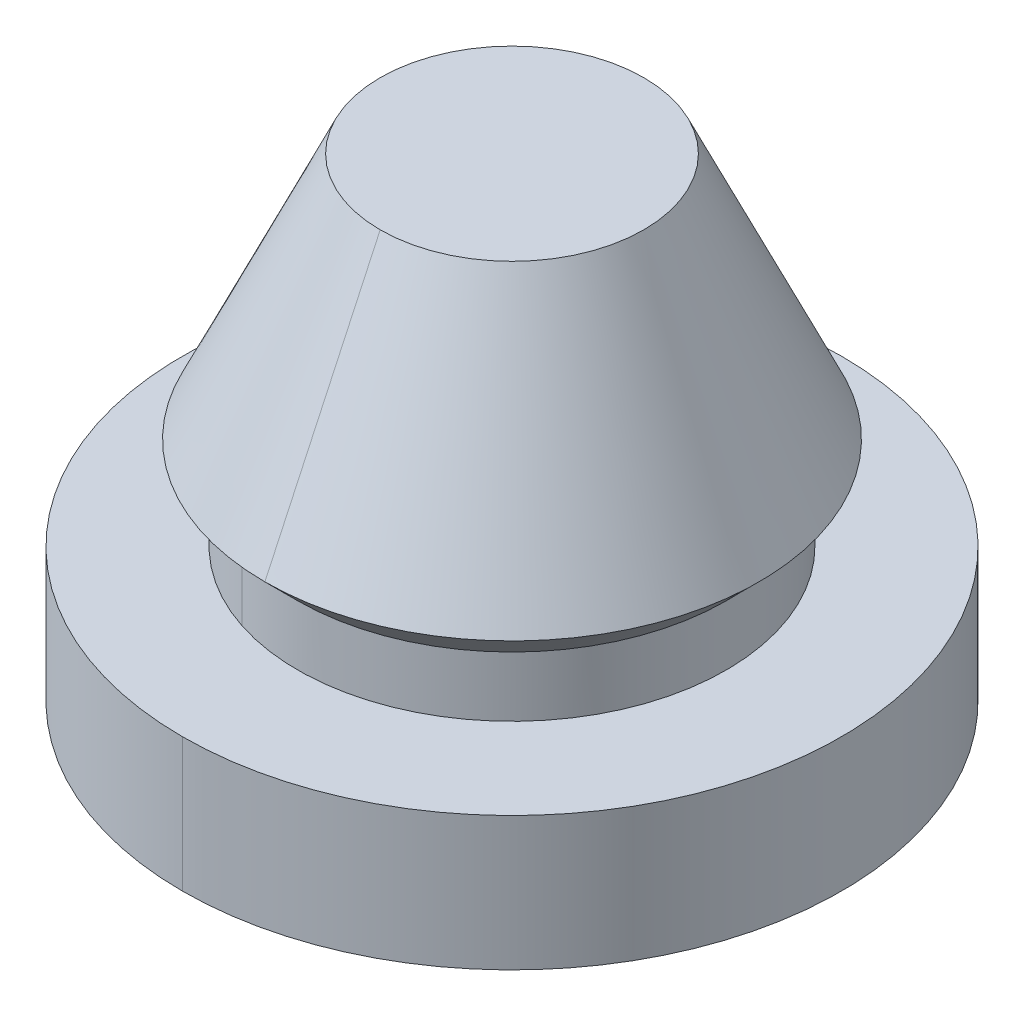
ISO-10303-21;
HEADER;
FILE_DESCRIPTION(('STEP AP214'),'2;1');
FILE_NAME('part.step','',(''),(''),'','','');
FILE_SCHEMA(('AUTOMOTIVE_DESIGN { 1 0 10303 214 1 1 1 1 }'));
ENDSEC;
DATA;
#1=APPLICATION_CONTEXT('core data for automotive mechanical design processes');
#2=APPLICATION_PROTOCOL_DEFINITION('international standard','automotive_design',2000,#1);
#3=PRODUCT_CONTEXT('',#1,'mechanical');
#4=PRODUCT('Part','Part','',(#3));
#5=PRODUCT_RELATED_PRODUCT_CATEGORY('part','',(#4));
#6=PRODUCT_DEFINITION_FORMATION('','',#4);
#7=PRODUCT_DEFINITION_CONTEXT('part definition',#1,'design');
#8=PRODUCT_DEFINITION('design','',#6,#7);
#9=PRODUCT_DEFINITION_SHAPE('','',#8);
#10=(LENGTH_UNIT() NAMED_UNIT(*) SI_UNIT(.MILLI.,.METRE.));
#11=(NAMED_UNIT(*) PLANE_ANGLE_UNIT() SI_UNIT($,.RADIAN.));
#12=(NAMED_UNIT(*) SI_UNIT($,.STERADIAN.) SOLID_ANGLE_UNIT());
#13=UNCERTAINTY_MEASURE_WITH_UNIT(LENGTH_MEASURE(1.E-05),#10,'distance_accuracy_value','');
#14=(GEOMETRIC_REPRESENTATION_CONTEXT(3) GLOBAL_UNCERTAINTY_ASSIGNED_CONTEXT((#13)) GLOBAL_UNIT_ASSIGNED_CONTEXT((#10,
#11,#12)) REPRESENTATION_CONTEXT('',''));
#15=CARTESIAN_POINT('',(0.,0.,0.));
#16=DIRECTION('',(0.,0.,1.));
#17=DIRECTION('',(1.,0.,0.));
#18=AXIS2_PLACEMENT_3D('',#15,#16,#17);
#19=CARTESIAN_POINT('',(0.,5.16,0.));
#20=DIRECTION('',(0.,-1.,0.));
#21=DIRECTION('',(0.,0.,-1.));
#22=AXIS2_PLACEMENT_3D('',#19,#20,#21);
#23=PLANE('',#22);
#24=CARTESIAN_POINT('',(0.,5.16,0.));
#25=DIRECTION('',(0.,-1.,0.));
#26=DIRECTION('',(0.,0.,-1.));
#27=AXIS2_PLACEMENT_3D('',#24,#25,#26);
#28=CIRCLE('',#27,2.);
#29=CARTESIAN_POINT('',(0.,5.16,2.));
#30=VERTEX_POINT('',#29);
#31=CARTESIAN_POINT('',(0.,5.16,-2.));
#32=VERTEX_POINT('',#31);
#33=EDGE_CURVE('E11',#30,#32,#28,.T.);
#34=ORIENTED_EDGE('',*,*,#33,.F.);
#35=CARTESIAN_POINT('',(0.,5.16,0.));
#36=DIRECTION('',(0.,-1.,0.));
#37=DIRECTION('',(0.,0.,-1.));
#38=AXIS2_PLACEMENT_3D('',#35,#36,#37);
#39=CIRCLE('',#38,2.);
#40=EDGE_CURVE('E25',#32,#30,#39,.T.);
#41=ORIENTED_EDGE('',*,*,#40,.F.);
#42=EDGE_LOOP('',(#34,#41));
#43=FACE_BOUND('',#42,.T.);
#44=ADVANCED_FACE('F16',(#43),#23,.F.);
#45=CARTESIAN_POINT('',(0.,5.16,0.));
#46=DIRECTION('',(0.,-1.,0.));
#47=DIRECTION('',(-1.,0.,0.));
#48=AXIS2_PLACEMENT_3D('',#45,#46,#47);
#49=CONICAL_SURFACE('',#48,2.,0.436332312998568);
#50=DIRECTION('',(0.,-0.906307787036656,0.422618261740687));
#51=VECTOR('',#50,1.);
#52=CARTESIAN_POINT('',(0.,5.16,2.));
#53=LINE('',#52,#51);
#54=CARTESIAN_POINT('',(0.,1.4090818557679,3.7490818557679));
#55=VERTEX_POINT('',#54);
#56=EDGE_CURVE('E195',#30,#55,#53,.T.);
#57=ORIENTED_EDGE('',*,*,#56,.T.);
#58=CARTESIAN_POINT('',(0.,1.4090818557679,0.));
#59=DIRECTION('',(0.,-1.,0.));
#60=DIRECTION('',(0.,0.,-1.));
#61=AXIS2_PLACEMENT_3D('',#58,#59,#60);
#62=CIRCLE('',#61,3.7490818557679);
#63=CARTESIAN_POINT('',(0.,1.4090818557679,-3.7490818557679));
#64=VERTEX_POINT('',#63);
#65=EDGE_CURVE('E189',#64,#55,#62,.T.);
#66=ORIENTED_EDGE('',*,*,#65,.F.);
#67=DIRECTION('',(0.,-0.906307787036656,-0.422618261740687));
#68=VECTOR('',#67,1.);
#69=CARTESIAN_POINT('',(0.,5.16,-2.));
#70=LINE('',#69,#68);
#71=EDGE_CURVE('E183',#32,#64,#70,.T.);
#72=ORIENTED_EDGE('',*,*,#71,.F.);
#73=ORIENTED_EDGE('',*,*,#40,.T.);
#74=EDGE_LOOP('',(#57,#66,#72,#73));
#75=FACE_BOUND('',#74,.T.);
#76=ADVANCED_FACE('F206',(#75),#49,.T.);
#77=CARTESIAN_POINT('',(0.,5.16,0.));
#78=DIRECTION('',(0.,-1.,0.));
#79=DIRECTION('',(1.,0.,0.));
#80=AXIS2_PLACEMENT_3D('',#77,#78,#79);
#81=CONICAL_SURFACE('',#80,2.,0.436332312998568);
#82=ORIENTED_EDGE('',*,*,#56,.F.);
#83=ORIENTED_EDGE('',*,*,#33,.T.);
#84=ORIENTED_EDGE('',*,*,#71,.T.);
#85=CARTESIAN_POINT('',(0.,1.4090818557679,0.));
#86=DIRECTION('',(0.,-1.,0.));
#87=DIRECTION('',(0.,0.,-1.));
#88=AXIS2_PLACEMENT_3D('',#85,#86,#87);
#89=CIRCLE('',#88,3.7490818557679);
#90=EDGE_CURVE('E177',#55,#64,#89,.T.);
#91=ORIENTED_EDGE('',*,*,#90,.F.);
#92=EDGE_LOOP('',(#82,#83,#84,#91));
#93=FACE_BOUND('',#92,.T.);
#94=ADVANCED_FACE('F209',(#93),#81,.T.);
#95=CARTESIAN_POINT('',(0.,1.4090818557679,0.));
#96=DIRECTION('',(0.,1.,0.));
#97=DIRECTION('',(1.,0.,0.));
#98=AXIS2_PLACEMENT_3D('',#95,#96,#97);
#99=CONICAL_SURFACE('',#98,3.7490818557679,0.785398163397448);
#100=DIRECTION('',(0.,0.707106781186548,-0.707106781186548));
#101=VECTOR('',#100,1.);
#102=CARTESIAN_POINT('',(0.,0.91,-3.25));
#103=LINE('',#102,#101);
#104=CARTESIAN_POINT('',(0.,0.91,-3.25));
#105=VERTEX_POINT('',#104);
#106=EDGE_CURVE('E171',#105,#64,#103,.T.);
#107=ORIENTED_EDGE('',*,*,#106,.F.);
#108=CARTESIAN_POINT('',(0.,0.91,0.));
#109=DIRECTION('',(0.,-1.,0.));
#110=DIRECTION('',(0.,0.,-1.));
#111=AXIS2_PLACEMENT_3D('',#108,#109,#110);
#112=CIRCLE('',#111,3.25);
#113=CARTESIAN_POINT('',(-1.00430523171858,0.91,3.09093367795925));
#114=VERTEX_POINT('',#113);
#115=EDGE_CURVE('E165',#114,#105,#112,.T.);
#116=ORIENTED_EDGE('',*,*,#115,.F.);
#117=CARTESIAN_POINT('',(0.,0.91,0.));
#118=DIRECTION('',(0.,-1.,0.));
#119=DIRECTION('',(0.,0.,-1.));
#120=AXIS2_PLACEMENT_3D('',#117,#118,#119);
#121=CIRCLE('',#120,3.25);
#122=CARTESIAN_POINT('',(0.,0.91,3.25));
#123=VERTEX_POINT('',#122);
#124=EDGE_CURVE('E159',#123,#114,#121,.T.);
#125=ORIENTED_EDGE('',*,*,#124,.F.);
#126=DIRECTION('',(0.,0.707106781186548,0.707106781186548));
#127=VECTOR('',#126,1.);
#128=CARTESIAN_POINT('',(0.,0.91,3.25));
#129=LINE('',#128,#127);
#130=EDGE_CURVE('E153',#123,#55,#129,.T.);
#131=ORIENTED_EDGE('',*,*,#130,.T.);
#132=ORIENTED_EDGE('',*,*,#90,.T.);
#133=EDGE_LOOP('',(#107,#116,#125,#131,#132));
#134=FACE_BOUND('',#133,.T.);
#135=ADVANCED_FACE('F212',(#134),#99,.T.);
#136=CARTESIAN_POINT('',(0.,1.4090818557679,0.));
#137=DIRECTION('',(0.,1.,0.));
#138=DIRECTION('',(-1.,0.,0.));
#139=AXIS2_PLACEMENT_3D('',#136,#137,#138);
#140=CONICAL_SURFACE('',#139,3.7490818557679,0.785398163397448);
#141=ORIENTED_EDGE('',*,*,#106,.T.);
#142=ORIENTED_EDGE('',*,*,#65,.T.);
#143=ORIENTED_EDGE('',*,*,#130,.F.);
#144=CARTESIAN_POINT('',(0.,0.91,0.));
#145=DIRECTION('',(0.,-1.,0.));
#146=DIRECTION('',(0.,0.,-1.));
#147=AXIS2_PLACEMENT_3D('',#144,#145,#146);
#148=CIRCLE('',#147,3.25);
#149=EDGE_CURVE('E147',#105,#123,#148,.T.);
#150=ORIENTED_EDGE('',*,*,#149,.F.);
#151=EDGE_LOOP('',(#141,#142,#143,#150));
#152=FACE_BOUND('',#151,.T.);
#153=ADVANCED_FACE('F215',(#152),#140,.T.);
#154=CARTESIAN_POINT('',(0.,-2.029,0.));
#155=DIRECTION('',(0.,-1.,0.));
#156=DIRECTION('',(-0.987688340595138,0.,-0.156434465040231));
#157=AXIS2_PLACEMENT_3D('',#154,#155,#156);
#158=CYLINDRICAL_SURFACE('',#157,3.25);
#159=DIRECTION('',(0.,-1.,0.));
#160=VECTOR('',#159,1.);
#161=CARTESIAN_POINT('',(-1.00430523171858,0.91,3.09093367795925));
#162=LINE('',#161,#160);
#163=CARTESIAN_POINT('',(-1.00430523171858,0.,3.09093367795925));
#164=VERTEX_POINT('',#163);
#165=EDGE_CURVE('E142',#114,#164,#162,.T.);
#166=ORIENTED_EDGE('',*,*,#165,.T.);
#167=CARTESIAN_POINT('',(0.,0.,0.));
#168=DIRECTION('',(0.,-1.,0.));
#169=DIRECTION('',(0.,0.,-1.));
#170=AXIS2_PLACEMENT_3D('',#167,#168,#169);
#171=CIRCLE('',#170,3.25);
#172=CARTESIAN_POINT('',(0.,0.,-3.25));
#173=VERTEX_POINT('',#172);
#174=EDGE_CURVE('E136',#173,#164,#171,.T.);
#175=ORIENTED_EDGE('',*,*,#174,.F.);
#176=DIRECTION('',(0.,-1.,0.));
#177=VECTOR('',#176,1.);
#178=CARTESIAN_POINT('',(0.,0.91,-3.25));
#179=LINE('',#178,#177);
#180=EDGE_CURVE('E130',#105,#173,#179,.T.);
#181=ORIENTED_EDGE('',*,*,#180,.F.);
#182=ORIENTED_EDGE('',*,*,#149,.T.);
#183=ORIENTED_EDGE('',*,*,#124,.T.);
#184=EDGE_LOOP('',(#166,#175,#181,#182,#183));
#185=FACE_BOUND('',#184,.T.);
#186=ADVANCED_FACE('F220',(#185),#158,.T.);
#187=CARTESIAN_POINT('',(0.,-2.029,0.));
#188=DIRECTION('',(0.,-1.,0.));
#189=DIRECTION('',(0.987688340595138,0.,0.156434465040231));
#190=AXIS2_PLACEMENT_3D('',#187,#188,#189);
#191=CYLINDRICAL_SURFACE('',#190,3.25);
#192=ORIENTED_EDGE('',*,*,#165,.F.);
#193=ORIENTED_EDGE('',*,*,#115,.T.);
#194=ORIENTED_EDGE('',*,*,#180,.T.);
#195=CARTESIAN_POINT('',(0.,0.,0.));
#196=DIRECTION('',(0.,-1.,0.));
#197=DIRECTION('',(0.,0.,-1.));
#198=AXIS2_PLACEMENT_3D('',#195,#196,#197);
#199=CIRCLE('',#198,3.25);
#200=EDGE_CURVE('E124',#164,#173,#199,.T.);
#201=ORIENTED_EDGE('',*,*,#200,.F.);
#202=EDGE_LOOP('',(#192,#193,#194,#201));
#203=FACE_BOUND('',#202,.T.);
#204=ADVANCED_FACE('F222',(#203),#191,.T.);
#205=CARTESIAN_POINT('',(3.25,0.,0.));
#206=DIRECTION('',(0.,-1.,0.));
#207=DIRECTION('',(0.,0.,-1.));
#208=AXIS2_PLACEMENT_3D('',#205,#206,#207);
#209=PLANE('',#208);
#210=CARTESIAN_POINT('',(0.,0.,0.));
#211=DIRECTION('',(0.,-1.,0.));
#212=DIRECTION('',(0.,0.,-1.));
#213=AXIS2_PLACEMENT_3D('',#210,#211,#212);
#214=CIRCLE('',#213,5.);
#215=CARTESIAN_POINT('',(0.,0.,5.));
#216=VERTEX_POINT('',#215);
#217=CARTESIAN_POINT('',(0.,0.,-5.));
#218=VERTEX_POINT('',#217);
#219=EDGE_CURVE('E99',#216,#218,#214,.T.);
#220=ORIENTED_EDGE('',*,*,#219,.F.);
#221=CARTESIAN_POINT('',(0.,0.,0.));
#222=DIRECTION('',(0.,-1.,0.));
#223=DIRECTION('',(0.,0.,-1.));
#224=AXIS2_PLACEMENT_3D('',#221,#222,#223);
#225=CIRCLE('',#224,5.);
#226=EDGE_CURVE('E116',#218,#216,#225,.T.);
#227=ORIENTED_EDGE('',*,*,#226,.F.);
#228=EDGE_LOOP('',(#220,#227));
#229=FACE_BOUND('',#228,.T.);
#230=ORIENTED_EDGE('',*,*,#174,.T.);
#231=ORIENTED_EDGE('',*,*,#200,.T.);
#232=EDGE_LOOP('',(#230,#231));
#233=FACE_BOUND('',#232,.T.);
#234=ADVANCED_FACE('F224',(#229,#233),#209,.F.);
#235=CARTESIAN_POINT('',(0.,-2.029,0.));
#236=DIRECTION('',(0.,-1.,0.));
#237=DIRECTION('',(-1.,0.,0.));
#238=AXIS2_PLACEMENT_3D('',#235,#236,#237);
#239=CYLINDRICAL_SURFACE('',#238,5.);
#240=DIRECTION('',(0.,-1.,0.));
#241=VECTOR('',#240,1.);
#242=CARTESIAN_POINT('',(0.,0.,5.));
#243=LINE('',#242,#241);
#244=CARTESIAN_POINT('',(0.,-2.029,5.));
#245=VERTEX_POINT('',#244);
#246=EDGE_CURVE('E90',#216,#245,#243,.T.);
#247=ORIENTED_EDGE('',*,*,#246,.T.);
#248=CARTESIAN_POINT('',(0.,-2.029,0.));
#249=DIRECTION('',(0.,-1.,0.));
#250=DIRECTION('',(0.,0.,-1.));
#251=AXIS2_PLACEMENT_3D('',#248,#249,#250);
#252=CIRCLE('',#251,5.);
#253=CARTESIAN_POINT('',(0.,-2.029,-5.));
#254=VERTEX_POINT('',#253);
#255=EDGE_CURVE('E83',#254,#245,#252,.T.);
#256=ORIENTED_EDGE('',*,*,#255,.F.);
#257=DIRECTION('',(0.,-1.,0.));
#258=VECTOR('',#257,1.);
#259=CARTESIAN_POINT('',(0.,0.,-5.));
#260=LINE('',#259,#258);
#261=EDGE_CURVE('E87',#218,#254,#260,.T.);
#262=ORIENTED_EDGE('',*,*,#261,.F.);
#263=ORIENTED_EDGE('',*,*,#226,.T.);
#264=EDGE_LOOP('',(#247,#256,#262,#263));
#265=FACE_BOUND('',#264,.T.);
#266=ADVANCED_FACE('F85',(#265),#239,.T.);
#267=CARTESIAN_POINT('',(0.,-2.029,0.));
#268=DIRECTION('',(0.,-1.,0.));
#269=DIRECTION('',(1.,0.,0.));
#270=AXIS2_PLACEMENT_3D('',#267,#268,#269);
#271=CYLINDRICAL_SURFACE('',#270,5.);
#272=ORIENTED_EDGE('',*,*,#246,.F.);
#273=ORIENTED_EDGE('',*,*,#219,.T.);
#274=ORIENTED_EDGE('',*,*,#261,.T.);
#275=CARTESIAN_POINT('',(0.,-2.029,0.));
#276=DIRECTION('',(0.,-1.,0.));
#277=DIRECTION('',(0.,0.,-1.));
#278=AXIS2_PLACEMENT_3D('',#275,#276,#277);
#279=CIRCLE('',#278,5.);
#280=EDGE_CURVE('E98',#245,#254,#279,.T.);
#281=ORIENTED_EDGE('',*,*,#280,.F.);
#282=EDGE_LOOP('',(#272,#273,#274,#281));
#283=FACE_BOUND('',#282,.T.);
#284=ADVANCED_FACE('F97',(#283),#271,.T.);
#285=CARTESIAN_POINT('',(5.,-2.029,0.));
#286=DIRECTION('',(0.,1.,0.));
#287=DIRECTION('',(0.,0.,1.));
#288=AXIS2_PLACEMENT_3D('',#285,#286,#287);
#289=PLANE('',#288);
#290=ORIENTED_EDGE('',*,*,#255,.T.);
#291=ORIENTED_EDGE('',*,*,#280,.T.);
#292=EDGE_LOOP('',(#290,#291));
#293=FACE_BOUND('',#292,.T.);
#294=ADVANCED_FACE('F102',(#293),#289,.F.);
#295=CLOSED_SHELL('',(#44,#76,#94,#135,#153,#186,#204,#234,#266,#284,#294));
#296=MANIFOLD_SOLID_BREP('B1',#295);
#297=ADVANCED_BREP_SHAPE_REPRESENTATION('',(#18,#296),#14);
#298=SHAPE_DEFINITION_REPRESENTATION(#9,#297);
ENDSEC;
END-ISO-10303-21;
